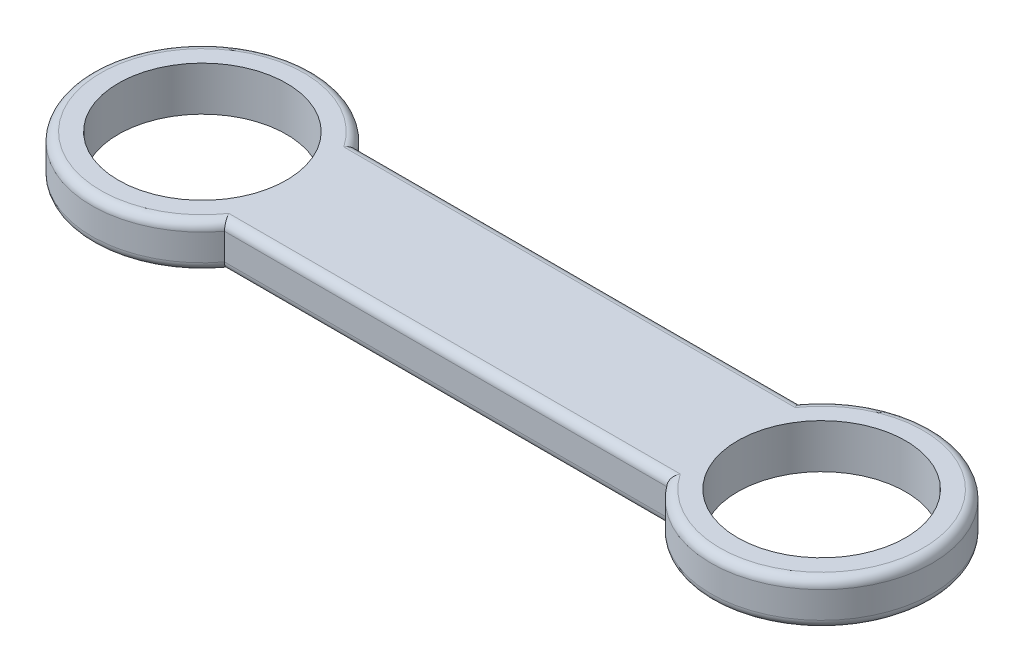
ISO-10303-21;
HEADER;
FILE_DESCRIPTION(('STEP AP214'),'2;1');
FILE_NAME('part.step','',(''),(''),'','','');
FILE_SCHEMA(('AUTOMOTIVE_DESIGN { 1 0 10303 214 1 1 1 1 }'));
ENDSEC;
DATA;
#1=APPLICATION_CONTEXT('core data for automotive mechanical design processes');
#2=APPLICATION_PROTOCOL_DEFINITION('international standard','automotive_design',2000,#1);
#3=PRODUCT_CONTEXT('',#1,'mechanical');
#4=PRODUCT('Part','Part','',(#3));
#5=PRODUCT_RELATED_PRODUCT_CATEGORY('part','',(#4));
#6=PRODUCT_DEFINITION_FORMATION('','',#4);
#7=PRODUCT_DEFINITION_CONTEXT('part definition',#1,'design');
#8=PRODUCT_DEFINITION('design','',#6,#7);
#9=PRODUCT_DEFINITION_SHAPE('','',#8);
#10=(LENGTH_UNIT() NAMED_UNIT(*) SI_UNIT(.MILLI.,.METRE.));
#11=(NAMED_UNIT(*) PLANE_ANGLE_UNIT() SI_UNIT($,.RADIAN.));
#12=(NAMED_UNIT(*) SI_UNIT($,.STERADIAN.) SOLID_ANGLE_UNIT());
#13=UNCERTAINTY_MEASURE_WITH_UNIT(LENGTH_MEASURE(1.E-05),#10,'distance_accuracy_value','');
#14=(GEOMETRIC_REPRESENTATION_CONTEXT(3) GLOBAL_UNCERTAINTY_ASSIGNED_CONTEXT((#13)) GLOBAL_UNIT_ASSIGNED_CONTEXT((#10,
#11,#12)) REPRESENTATION_CONTEXT('',''));
#15=CARTESIAN_POINT('',(0.,0.,0.));
#16=DIRECTION('',(0.,0.,1.));
#17=DIRECTION('',(1.,0.,0.));
#18=AXIS2_PLACEMENT_3D('',#15,#16,#17);
#19=CARTESIAN_POINT('',(0.,5.,0.));
#20=DIRECTION('',(0.,1.,0.));
#21=DIRECTION('',(0.,0.,1.));
#22=AXIS2_PLACEMENT_3D('',#19,#20,#21);
#23=PLANE('',#22);
#24=DIRECTION('',(1.,0.,0.));
#25=VECTOR('',#24,1.);
#26=CARTESIAN_POINT('',(60.,5.,6.5));
#27=LINE('',#26,#25);
#28=CARTESIAN_POINT('',(9.48683298050518,5.,6.5));
#29=VERTEX_POINT('',#28);
#30=CARTESIAN_POINT('',(60.5131670194948,5.,6.5));
#31=VERTEX_POINT('',#30);
#32=EDGE_CURVE('E271',#29,#31,#27,.T.);
#33=ORIENTED_EDGE('',*,*,#32,.T.);
#34=CARTESIAN_POINT('',(70.,5.,0.));
#35=DIRECTION('',(0.,1.,0.));
#36=DIRECTION('',(0.,0.,1.));
#37=AXIS2_PLACEMENT_3D('',#34,#35,#36);
#38=CIRCLE('',#37,11.5);
#39=CARTESIAN_POINT('',(60.5131670194948,5.,-6.5));
#40=VERTEX_POINT('',#39);
#41=EDGE_CURVE('E11',#31,#40,#38,.T.);
#42=ORIENTED_EDGE('',*,*,#41,.T.);
#43=DIRECTION('',(-1.,0.,0.));
#44=VECTOR('',#43,1.);
#45=CARTESIAN_POINT('',(10.,5.,-6.5));
#46=LINE('',#45,#44);
#47=CARTESIAN_POINT('',(9.48683298050518,5.,-6.49999999999993));
#48=VERTEX_POINT('',#47);
#49=EDGE_CURVE('E51',#40,#48,#46,.T.);
#50=ORIENTED_EDGE('',*,*,#49,.T.);
#51=CARTESIAN_POINT('',(0.,5.,0.));
#52=DIRECTION('',(0.,1.,0.));
#53=DIRECTION('',(0.,0.,1.));
#54=AXIS2_PLACEMENT_3D('',#51,#52,#53);
#55=CIRCLE('',#54,11.5);
#56=EDGE_CURVE('E273',#48,#29,#55,.T.);
#57=ORIENTED_EDGE('',*,*,#56,.T.);
#58=EDGE_LOOP('',(#33,#42,#50,#57));
#59=FACE_BOUND('',#58,.T.);
#60=CARTESIAN_POINT('',(0.,5.,0.));
#61=DIRECTION('',(0.,1.,0.));
#62=DIRECTION('',(0.,0.,1.));
#63=AXIS2_PLACEMENT_3D('',#60,#61,#62);
#64=CIRCLE('',#63,9.5);
#65=CARTESIAN_POINT('',(0.,5.,9.5));
#66=VERTEX_POINT('',#65);
#67=EDGE_CURVE('E297',#66,#66,#64,.T.);
#68=ORIENTED_EDGE('',*,*,#67,.F.);
#69=EDGE_LOOP('',(#68));
#70=FACE_BOUND('',#69,.T.);
#71=CARTESIAN_POINT('',(70.,5.,0.));
#72=DIRECTION('',(0.,1.,0.));
#73=DIRECTION('',(0.,0.,1.));
#74=AXIS2_PLACEMENT_3D('',#71,#72,#73);
#75=CIRCLE('',#74,9.49999999999999);
#76=CARTESIAN_POINT('',(70.,5.,9.49999999999999));
#77=VERTEX_POINT('',#76);
#78=EDGE_CURVE('E289',#77,#77,#75,.T.);
#79=ORIENTED_EDGE('',*,*,#78,.F.);
#80=EDGE_LOOP('',(#79));
#81=FACE_BOUND('',#80,.T.);
#82=ADVANCED_FACE('F37',(#59,#70,#81),#23,.T.);
#83=CARTESIAN_POINT('',(0.,0.,0.));
#84=DIRECTION('',(0.,1.,0.));
#85=DIRECTION('',(0.,0.,1.));
#86=AXIS2_PLACEMENT_3D('',#83,#84,#85);
#87=PLANE('',#86);
#88=DIRECTION('',(-1.,0.,0.));
#89=VECTOR('',#88,1.);
#90=CARTESIAN_POINT('',(0.,0.,-6.5));
#91=LINE('',#90,#89);
#92=CARTESIAN_POINT('',(9.48683298050518,0.,-6.49999999999993));
#93=VERTEX_POINT('',#92);
#94=CARTESIAN_POINT('',(60.5131670194948,0.,-6.5));
#95=VERTEX_POINT('',#94);
#96=EDGE_CURVE('E254',#93,#95,#91,.F.);
#97=ORIENTED_EDGE('',*,*,#96,.T.);
#98=CARTESIAN_POINT('',(70.,0.,0.));
#99=DIRECTION('',(0.,1.,0.));
#100=DIRECTION('',(0.,0.,1.));
#101=AXIS2_PLACEMENT_3D('',#98,#99,#100);
#102=CIRCLE('',#101,11.5);
#103=CARTESIAN_POINT('',(60.5131670194948,0.,6.5));
#104=VERTEX_POINT('',#103);
#105=EDGE_CURVE('E120',#95,#104,#102,.F.);
#106=ORIENTED_EDGE('',*,*,#105,.T.);
#107=DIRECTION('',(1.,0.,0.));
#108=VECTOR('',#107,1.);
#109=CARTESIAN_POINT('',(0.,0.,6.5));
#110=LINE('',#109,#108);
#111=CARTESIAN_POINT('',(9.48683298050518,0.,6.5));
#112=VERTEX_POINT('',#111);
#113=EDGE_CURVE('E259',#104,#112,#110,.F.);
#114=ORIENTED_EDGE('',*,*,#113,.T.);
#115=CARTESIAN_POINT('',(0.,0.,0.));
#116=DIRECTION('',(0.,1.,0.));
#117=DIRECTION('',(0.,0.,1.));
#118=AXIS2_PLACEMENT_3D('',#115,#116,#117);
#119=CIRCLE('',#118,11.5);
#120=EDGE_CURVE('E248',#112,#93,#119,.F.);
#121=ORIENTED_EDGE('',*,*,#120,.T.);
#122=EDGE_LOOP('',(#97,#106,#114,#121));
#123=FACE_BOUND('',#122,.T.);
#124=CARTESIAN_POINT('',(0.,0.,0.));
#125=DIRECTION('',(0.,1.,0.));
#126=DIRECTION('',(0.,0.,1.));
#127=AXIS2_PLACEMENT_3D('',#124,#125,#126);
#128=CIRCLE('',#127,9.5);
#129=CARTESIAN_POINT('',(0.,0.,9.5));
#130=VERTEX_POINT('',#129);
#131=EDGE_CURVE('E294',#130,#130,#128,.T.);
#132=ORIENTED_EDGE('',*,*,#131,.T.);
#133=EDGE_LOOP('',(#132));
#134=FACE_BOUND('',#133,.T.);
#135=CARTESIAN_POINT('',(70.,0.,0.));
#136=DIRECTION('',(0.,1.,0.));
#137=DIRECTION('',(0.,0.,1.));
#138=AXIS2_PLACEMENT_3D('',#135,#136,#137);
#139=CIRCLE('',#138,9.49999999999999);
#140=CARTESIAN_POINT('',(70.,0.,9.49999999999999));
#141=VERTEX_POINT('',#140);
#142=EDGE_CURVE('E287',#141,#141,#139,.T.);
#143=ORIENTED_EDGE('',*,*,#142,.T.);
#144=EDGE_LOOP('',(#143));
#145=FACE_BOUND('',#144,.T.);
#146=ADVANCED_FACE('F179',(#123,#134,#145),#87,.F.);
#147=CARTESIAN_POINT('',(0.,5.,0.));
#148=DIRECTION('',(0.,-1.,0.));
#149=DIRECTION('',(0.,0.,-1.));
#150=AXIS2_PLACEMENT_3D('',#147,#148,#149);
#151=CYLINDRICAL_SURFACE('',#150,12.5);
#152=DIRECTION('',(0.,-1.,0.));
#153=VECTOR('',#152,1.);
#154=CARTESIAN_POINT('',(10.,5.,-7.5));
#155=LINE('',#154,#153);
#156=CARTESIAN_POINT('',(10.,4.,-7.5));
#157=VERTEX_POINT('',#156);
#158=CARTESIAN_POINT('',(10.,1.,-7.5));
#159=VERTEX_POINT('',#158);
#160=EDGE_CURVE('E115',#157,#159,#155,.T.);
#161=ORIENTED_EDGE('',*,*,#160,.T.);
#162=CARTESIAN_POINT('',(0.,1.,0.));
#163=DIRECTION('',(0.,1.,0.));
#164=DIRECTION('',(0.,0.,1.));
#165=AXIS2_PLACEMENT_3D('',#162,#163,#164);
#166=CIRCLE('',#165,12.5);
#167=CARTESIAN_POINT('',(10.,1.,7.5));
#168=VERTEX_POINT('',#167);
#169=EDGE_CURVE('E250',#159,#168,#166,.T.);
#170=ORIENTED_EDGE('',*,*,#169,.T.);
#171=DIRECTION('',(0.,-1.,0.));
#172=VECTOR('',#171,1.);
#173=CARTESIAN_POINT('',(10.,5.,7.5));
#174=LINE('',#173,#172);
#175=CARTESIAN_POINT('',(10.,4.,7.5));
#176=VERTEX_POINT('',#175);
#177=EDGE_CURVE('E137',#176,#168,#174,.T.);
#178=ORIENTED_EDGE('',*,*,#177,.F.);
#179=CARTESIAN_POINT('',(0.,4.,0.));
#180=DIRECTION('',(0.,1.,0.));
#181=DIRECTION('',(0.,0.,1.));
#182=AXIS2_PLACEMENT_3D('',#179,#180,#181);
#183=CIRCLE('',#182,12.5);
#184=EDGE_CURVE('E264',#176,#157,#183,.F.);
#185=ORIENTED_EDGE('',*,*,#184,.T.);
#186=EDGE_LOOP('',(#161,#170,#178,#185));
#187=FACE_BOUND('',#186,.T.);
#188=ADVANCED_FACE('F184',(#187),#151,.T.);
#189=CARTESIAN_POINT('',(10.,5.,7.5));
#190=DIRECTION('',(0.,0.,-1.));
#191=DIRECTION('',(-1.,0.,0.));
#192=AXIS2_PLACEMENT_3D('',#189,#190,#191);
#193=PLANE('',#192);
#194=ORIENTED_EDGE('',*,*,#177,.T.);
#195=DIRECTION('',(1.,0.,0.));
#196=VECTOR('',#195,1.);
#197=CARTESIAN_POINT('',(10.,1.,7.5));
#198=LINE('',#197,#196);
#199=CARTESIAN_POINT('',(60.,1.,7.5));
#200=VERTEX_POINT('',#199);
#201=EDGE_CURVE('E269',#168,#200,#198,.T.);
#202=ORIENTED_EDGE('',*,*,#201,.T.);
#203=DIRECTION('',(0.,-1.,0.));
#204=VECTOR('',#203,1.);
#205=CARTESIAN_POINT('',(60.,5.,7.5));
#206=LINE('',#205,#204);
#207=CARTESIAN_POINT('',(60.,4.,7.5));
#208=VERTEX_POINT('',#207);
#209=EDGE_CURVE('E131',#208,#200,#206,.T.);
#210=ORIENTED_EDGE('',*,*,#209,.F.);
#211=DIRECTION('',(1.,0.,0.));
#212=VECTOR('',#211,1.);
#213=CARTESIAN_POINT('',(10.,4.,7.5));
#214=LINE('',#213,#212);
#215=EDGE_CURVE('E267',#208,#176,#214,.F.);
#216=ORIENTED_EDGE('',*,*,#215,.T.);
#217=EDGE_LOOP('',(#194,#202,#210,#216));
#218=FACE_BOUND('',#217,.T.);
#219=ADVANCED_FACE('F196',(#218),#193,.F.);
#220=CARTESIAN_POINT('',(70.,5.,0.));
#221=DIRECTION('',(0.,-1.,0.));
#222=DIRECTION('',(0.,0.,-1.));
#223=AXIS2_PLACEMENT_3D('',#220,#221,#222);
#224=CYLINDRICAL_SURFACE('',#223,12.5);
#225=ORIENTED_EDGE('',*,*,#209,.T.);
#226=CARTESIAN_POINT('',(70.,1.,0.));
#227=DIRECTION('',(0.,1.,0.));
#228=DIRECTION('',(0.,0.,1.));
#229=AXIS2_PLACEMENT_3D('',#226,#227,#228);
#230=CIRCLE('',#229,12.5);
#231=CARTESIAN_POINT('',(60.,1.,-7.5));
#232=VERTEX_POINT('',#231);
#233=EDGE_CURVE('E130',#200,#232,#230,.T.);
#234=ORIENTED_EDGE('',*,*,#233,.T.);
#235=DIRECTION('',(0.,-1.,0.));
#236=VECTOR('',#235,1.);
#237=CARTESIAN_POINT('',(60.,5.,-7.5));
#238=LINE('',#237,#236);
#239=CARTESIAN_POINT('',(60.,4.,-7.5));
#240=VERTEX_POINT('',#239);
#241=EDGE_CURVE('E113',#240,#232,#238,.T.);
#242=ORIENTED_EDGE('',*,*,#241,.F.);
#243=CARTESIAN_POINT('',(70.,4.,0.));
#244=DIRECTION('',(0.,1.,0.));
#245=DIRECTION('',(0.,0.,1.));
#246=AXIS2_PLACEMENT_3D('',#243,#244,#245);
#247=CIRCLE('',#246,12.5);
#248=EDGE_CURVE('E127',#240,#208,#247,.F.);
#249=ORIENTED_EDGE('',*,*,#248,.T.);
#250=EDGE_LOOP('',(#225,#234,#242,#249));
#251=FACE_BOUND('',#250,.T.);
#252=ADVANCED_FACE('F126',(#251),#224,.T.);
#253=CARTESIAN_POINT('',(10.,5.,-7.5));
#254=DIRECTION('',(0.,0.,1.));
#255=DIRECTION('',(1.,0.,0.));
#256=AXIS2_PLACEMENT_3D('',#253,#254,#255);
#257=PLANE('',#256);
#258=ORIENTED_EDGE('',*,*,#241,.T.);
#259=DIRECTION('',(-1.,0.,0.));
#260=VECTOR('',#259,1.);
#261=CARTESIAN_POINT('',(10.,1.,-7.5));
#262=LINE('',#261,#260);
#263=EDGE_CURVE('E119',#232,#159,#262,.T.);
#264=ORIENTED_EDGE('',*,*,#263,.T.);
#265=ORIENTED_EDGE('',*,*,#160,.F.);
#266=DIRECTION('',(-1.,0.,0.));
#267=VECTOR('',#266,1.);
#268=CARTESIAN_POINT('',(60.,4.,-7.5));
#269=LINE('',#268,#267);
#270=EDGE_CURVE('E110',#157,#240,#269,.F.);
#271=ORIENTED_EDGE('',*,*,#270,.T.);
#272=EDGE_LOOP('',(#258,#264,#265,#271));
#273=FACE_BOUND('',#272,.T.);
#274=ADVANCED_FACE('F112',(#273),#257,.F.);
#275=CARTESIAN_POINT('',(0.,5.,0.));
#276=DIRECTION('',(0.,-1.,0.));
#277=DIRECTION('',(0.,0.,-1.));
#278=AXIS2_PLACEMENT_3D('',#275,#276,#277);
#279=CYLINDRICAL_SURFACE('',#278,9.5);
#280=ORIENTED_EDGE('',*,*,#67,.T.);
#281=EDGE_LOOP('',(#280));
#282=FACE_BOUND('',#281,.T.);
#283=ORIENTED_EDGE('',*,*,#131,.F.);
#284=EDGE_LOOP('',(#283));
#285=FACE_BOUND('',#284,.T.);
#286=ADVANCED_FACE('F189',(#282,#285),#279,.F.);
#287=CARTESIAN_POINT('',(70.,5.,0.));
#288=DIRECTION('',(0.,-1.,0.));
#289=DIRECTION('',(0.,0.,-1.));
#290=AXIS2_PLACEMENT_3D('',#287,#288,#289);
#291=CYLINDRICAL_SURFACE('',#290,9.49999999999999);
#292=ORIENTED_EDGE('',*,*,#78,.T.);
#293=EDGE_LOOP('',(#292));
#294=FACE_BOUND('',#293,.T.);
#295=ORIENTED_EDGE('',*,*,#142,.F.);
#296=EDGE_LOOP('',(#295));
#297=FACE_BOUND('',#296,.T.);
#298=ADVANCED_FACE('F235',(#294,#297),#291,.F.);
#299=CARTESIAN_POINT('',(0.,1.,0.));
#300=DIRECTION('',(0.,1.,0.));
#301=DIRECTION('',(0.,0.,1.));
#302=AXIS2_PLACEMENT_3D('',#299,#300,#301);
#303=TOROIDAL_SURFACE('',#302,11.5,1.);
#304=CARTESIAN_POINT('',(10.,1.,-7.5));
#305=CARTESIAN_POINT('',(10.0000004758087,0.974022793311546,-7.500001202886));
#306=CARTESIAN_POINT('',(9.99949352827707,0.948058855470432,-7.49898703068729));
#307=CARTESIAN_POINT('',(9.99747493147311,0.896333533341106,-7.49495034829581));
#308=CARTESIAN_POINT('',(9.99596354221496,0.870572098377917,-7.49192835785571));
#309=CARTESIAN_POINT('',(9.98995487397723,0.794056155931436,-7.47991814361837));
#310=CARTESIAN_POINT('',(9.98398288866724,0.743842783014862,-7.46798523082094));
#311=CARTESIAN_POINT('',(9.96835522827276,0.646423053679939,-7.43680458576413));
#312=CARTESIAN_POINT('',(9.95870150303451,0.599215120999351,-7.41756072539695));
#313=CARTESIAN_POINT('',(9.93607459389465,0.508864905381531,-7.37254507090801));
#314=CARTESIAN_POINT('',(9.92309948357589,0.465725001855554,-7.34676948844785));
#315=CARTESIAN_POINT('',(9.89368047892262,0.382754449695858,-7.28846890109732));
#316=CARTESIAN_POINT('',(9.87711681533836,0.343130182966889,-7.25571173192295));
#317=CARTESIAN_POINT('',(9.84138609262994,0.26992653542802,-7.1852561146381));
#318=CARTESIAN_POINT('',(9.82221830455551,0.236348853328713,-7.14755628307423));
#319=CARTESIAN_POINT('',(9.77976166471258,0.172623211243956,-7.06432445679231));
#320=CARTESIAN_POINT('',(9.75625239975256,0.143153462494501,-7.01838625967242));
#321=CARTESIAN_POINT('',(9.70731652672982,0.0923269903444444,-6.92313950811566));
#322=CARTESIAN_POINT('',(9.68188843175124,0.0709766377249933,-6.87382834276639));
#323=CARTESIAN_POINT('',(9.62914011418951,0.0361537771219373,-6.77196281506131));
#324=CARTESIAN_POINT('',(9.60179035574918,0.0228674058039202,-6.71936066989013));
#325=CARTESIAN_POINT('',(9.54634265158448,0.00497372626209113,-6.613189213109));
#326=CARTESIAN_POINT('',(9.51824635996518,0.000348627834511646,-6.55962211265339));
#327=CARTESIAN_POINT('',(9.48899724180388,6.31232286596967E-06,-6.50410674552687));
#328=CARTESIAN_POINT('',(9.48791515406522,-1.24397043238607E-08,-6.50205327685659));
#329=CARTESIAN_POINT('',(9.48683298050514,0.,-6.5));
#330=B_SPLINE_CURVE_WITH_KNOTS('',3,(#304,#305,#306,#307,#308,#309,#310,#311,#312,#313,#314,
#315,#316,#317,#318,#319,#320,#321,#322,#323,#324,#325,#326,#327,#328,#329),.UNSPECIFIED.,.F.,
.F.,(4,2,2,2,2,2,2,2,2,2,2,2,4),(0.,0.0778809431952193,0.155741733637133,0.310790795766131,
0.465757857817843,0.620815005872289,0.782188307542208,0.943606874488299,1.12115873988898,
1.29884963307286,1.48049988198648,1.66177661137021,1.66873998826391),.UNSPECIFIED.);
#331=EDGE_CURVE('E222',#93,#159,#330,.F.);
#332=ORIENTED_EDGE('',*,*,#331,.F.);
#333=ORIENTED_EDGE('',*,*,#120,.F.);
#334=CARTESIAN_POINT('',(10.,1.,7.5));
#335=CARTESIAN_POINT('',(10.0000004758087,0.974022793311546,7.500001202886));
#336=CARTESIAN_POINT('',(9.99949352827707,0.948058855470432,7.49898703068729));
#337=CARTESIAN_POINT('',(9.99747493147311,0.896333533341106,7.49495034829581));
#338=CARTESIAN_POINT('',(9.99596354221496,0.870572098377917,7.49192835785571));
#339=CARTESIAN_POINT('',(9.98995487397723,0.794056155931436,7.47991814361837));
#340=CARTESIAN_POINT('',(9.98398288866724,0.743842783014862,7.46798523082094));
#341=CARTESIAN_POINT('',(9.96835522827276,0.646423053679939,7.43680458576413));
#342=CARTESIAN_POINT('',(9.95870150303451,0.599215120999351,7.41756072539695));
#343=CARTESIAN_POINT('',(9.93607459389465,0.508864905381531,7.37254507090801));
#344=CARTESIAN_POINT('',(9.92309948357589,0.465725001855554,7.34676948844785));
#345=CARTESIAN_POINT('',(9.89368047892262,0.382754449695858,7.28846890109732));
#346=CARTESIAN_POINT('',(9.87711681533836,0.343130182966889,7.25571173192295));
#347=CARTESIAN_POINT('',(9.84138609262994,0.26992653542802,7.1852561146381));
#348=CARTESIAN_POINT('',(9.82221830455551,0.236348853328713,7.14755628307423));
#349=CARTESIAN_POINT('',(9.77976166471258,0.172623211243956,7.06432445679231));
#350=CARTESIAN_POINT('',(9.75625239975256,0.143153462494501,7.01838625967242));
#351=CARTESIAN_POINT('',(9.70731652672982,0.0923269903444444,6.92313950811566));
#352=CARTESIAN_POINT('',(9.68188843175124,0.0709766377249933,6.87382834276639));
#353=CARTESIAN_POINT('',(9.62914011418951,0.0361537771219373,6.77196281506131));
#354=CARTESIAN_POINT('',(9.60179035574918,0.0228674058039202,6.71936066989013));
#355=CARTESIAN_POINT('',(9.54634265158448,0.00497372626209113,6.613189213109));
#356=CARTESIAN_POINT('',(9.51824635996518,0.000348627834511646,6.55962211265339));
#357=CARTESIAN_POINT('',(9.48899724180388,6.31232286596966E-06,6.50410674552687));
#358=CARTESIAN_POINT('',(9.48791515406522,-1.24397043238662E-08,6.50205327685659));
#359=CARTESIAN_POINT('',(9.48683298050514,0.,6.5));
#360=B_SPLINE_CURVE_WITH_KNOTS('',3,(#334,#335,#336,#337,#338,#339,#340,#341,#342,#343,#344,
#345,#346,#347,#348,#349,#350,#351,#352,#353,#354,#355,#356,#357,#358,#359),.UNSPECIFIED.,.F.,
.F.,(4,2,2,2,2,2,2,2,2,2,2,2,4),(0.,0.0778809431952193,0.155741733637133,0.310790795766131,
0.465757857817843,0.620815005872289,0.782188307542208,0.943606874488299,1.12115873988898,
1.29884963307286,1.48049988198648,1.66177661137021,1.66873998826391),.UNSPECIFIED.);
#361=EDGE_CURVE('E150',#168,#112,#360,.T.);
#362=ORIENTED_EDGE('',*,*,#361,.F.);
#363=ORIENTED_EDGE('',*,*,#169,.F.);
#364=EDGE_LOOP('',(#332,#333,#362,#363));
#365=FACE_BOUND('',#364,.T.);
#366=ADVANCED_FACE('F230',(#365),#303,.T.);
#367=CARTESIAN_POINT('',(10.,1.,6.5));
#368=DIRECTION('',(1.,0.,0.));
#369=DIRECTION('',(0.,0.,-1.));
#370=AXIS2_PLACEMENT_3D('',#367,#368,#369);
#371=CYLINDRICAL_SURFACE('',#370,1.);
#372=ORIENTED_EDGE('',*,*,#361,.T.);
#373=ORIENTED_EDGE('',*,*,#113,.F.);
#374=CARTESIAN_POINT('',(60.,1.,7.5));
#375=CARTESIAN_POINT('',(59.9999995241913,0.974022793311546,7.500001202886));
#376=CARTESIAN_POINT('',(60.0005064717229,0.948058855470432,7.49898703068729));
#377=CARTESIAN_POINT('',(60.0025250685269,0.896333533341106,7.49495034829581));
#378=CARTESIAN_POINT('',(60.004036457785,0.870572098377917,7.49192835785571));
#379=CARTESIAN_POINT('',(60.0100451260228,0.794056155931436,7.47991814361837));
#380=CARTESIAN_POINT('',(60.0160171113328,0.743842783014862,7.46798523082094));
#381=CARTESIAN_POINT('',(60.0316447717273,0.646423053679939,7.43680458576413));
#382=CARTESIAN_POINT('',(60.0412984969655,0.599215120999351,7.41756072539694));
#383=CARTESIAN_POINT('',(60.0639254061053,0.508864905381532,7.37254507090801));
#384=CARTESIAN_POINT('',(60.0769005164241,0.465725001855554,7.34676948844785));
#385=CARTESIAN_POINT('',(60.1063195210774,0.382754449695858,7.28846890109731));
#386=CARTESIAN_POINT('',(60.1228831846616,0.34313018296689,7.25571173192295));
#387=CARTESIAN_POINT('',(60.1586139073701,0.269926535428021,7.1852561146381));
#388=CARTESIAN_POINT('',(60.1777816954445,0.236348853328713,7.14755628307423));
#389=CARTESIAN_POINT('',(60.2202383352874,0.172623211243956,7.06432445679231));
#390=CARTESIAN_POINT('',(60.2437476002475,0.143153462494501,7.01838625967242));
#391=CARTESIAN_POINT('',(60.2926834732702,0.0923269903444444,6.92313950811565));
#392=CARTESIAN_POINT('',(60.3181115682488,0.070976637724993,6.87382834276639));
#393=CARTESIAN_POINT('',(60.3708598858105,0.0361537771219368,6.77196281506131));
#394=CARTESIAN_POINT('',(60.3982096442508,0.0228674058039199,6.71936066989013));
#395=CARTESIAN_POINT('',(60.4536573484155,0.00497372626209091,6.61318921310899));
#396=CARTESIAN_POINT('',(60.4817536400348,0.000348627834511574,6.55962211265337));
#397=CARTESIAN_POINT('',(60.5110027581961,6.3123228659665E-06,6.50410674552687));
#398=CARTESIAN_POINT('',(60.5120848459348,-1.24397043246441E-08,6.50205327685659));
#399=CARTESIAN_POINT('',(60.5131670194949,0.,6.5));
#400=B_SPLINE_CURVE_WITH_KNOTS('',3,(#374,#375,#376,#377,#378,#379,#380,#381,#382,#383,#384,
#385,#386,#387,#388,#389,#390,#391,#392,#393,#394,#395,#396,#397,#398,#399),.UNSPECIFIED.,.F.,
.F.,(4,2,2,2,2,2,2,2,2,2,2,2,4),(0.,0.0778809431952194,0.155741733637133,0.310790795766131,
0.465757857817842,0.620815005872288,0.782188307542209,0.943606874488298,1.12115873988898,
1.29884963307286,1.48049988198648,1.66177661137022,1.66873998826391),.UNSPECIFIED.);
#401=EDGE_CURVE('E217',#200,#104,#400,.T.);
#402=ORIENTED_EDGE('',*,*,#401,.F.);
#403=ORIENTED_EDGE('',*,*,#201,.F.);
#404=EDGE_LOOP('',(#372,#373,#402,#403));
#405=FACE_BOUND('',#404,.T.);
#406=ADVANCED_FACE('F227',(#405),#371,.T.);
#407=CARTESIAN_POINT('',(10.,1.,-6.5));
#408=DIRECTION('',(-1.,0.,0.));
#409=DIRECTION('',(0.,0.,1.));
#410=AXIS2_PLACEMENT_3D('',#407,#408,#409);
#411=CYLINDRICAL_SURFACE('',#410,1.);
#412=ORIENTED_EDGE('',*,*,#331,.T.);
#413=ORIENTED_EDGE('',*,*,#263,.F.);
#414=CARTESIAN_POINT('',(60.,1.,-7.5));
#415=CARTESIAN_POINT('',(59.9999995241913,0.974022793311546,-7.500001202886));
#416=CARTESIAN_POINT('',(60.0005064717229,0.948058855470432,-7.49898703068729));
#417=CARTESIAN_POINT('',(60.0025250685269,0.896333533341106,-7.49495034829581));
#418=CARTESIAN_POINT('',(60.004036457785,0.870572098377917,-7.49192835785571));
#419=CARTESIAN_POINT('',(60.0100451260228,0.794056155931436,-7.47991814361837));
#420=CARTESIAN_POINT('',(60.0160171113328,0.743842783014862,-7.46798523082094));
#421=CARTESIAN_POINT('',(60.0316447717273,0.646423053679939,-7.43680458576413));
#422=CARTESIAN_POINT('',(60.0412984969655,0.599215120999351,-7.41756072539695));
#423=CARTESIAN_POINT('',(60.0639254061053,0.508864905381531,-7.37254507090801));
#424=CARTESIAN_POINT('',(60.0769005164241,0.465725001855553,-7.34676948844785));
#425=CARTESIAN_POINT('',(60.1063195210774,0.382754449695857,-7.28846890109732));
#426=CARTESIAN_POINT('',(60.1228831846616,0.343130182966889,-7.25571173192295));
#427=CARTESIAN_POINT('',(60.1586139073701,0.26992653542802,-7.1852561146381));
#428=CARTESIAN_POINT('',(60.1777816954445,0.236348853328713,-7.14755628307423));
#429=CARTESIAN_POINT('',(60.2202383352874,0.172623211243956,-7.06432445679231));
#430=CARTESIAN_POINT('',(60.2437476002475,0.1431534624945,-7.01838625967242));
#431=CARTESIAN_POINT('',(60.2926834732702,0.0923269903444442,-6.92313950811565));
#432=CARTESIAN_POINT('',(60.3181115682488,0.0709766377249937,-6.87382834276639));
#433=CARTESIAN_POINT('',(60.3708598858105,0.0361537771219387,-6.77196281506131));
#434=CARTESIAN_POINT('',(60.3982096442508,0.0228674058039219,-6.71936066989014));
#435=CARTESIAN_POINT('',(60.4536573484155,0.00497372626209207,-6.613189213109));
#436=CARTESIAN_POINT('',(60.4817536400348,0.000348627834512351,-6.55962211265338));
#437=CARTESIAN_POINT('',(60.5110027581961,6.31232286601901E-06,-6.50410674552687));
#438=CARTESIAN_POINT('',(60.5120848459348,-1.24397042993203E-08,-6.50205327685659));
#439=CARTESIAN_POINT('',(60.5131670194949,0.,-6.5));
#440=B_SPLINE_CURVE_WITH_KNOTS('',3,(#414,#415,#416,#417,#418,#419,#420,#421,#422,#423,#424,
#425,#426,#427,#428,#429,#430,#431,#432,#433,#434,#435,#436,#437,#438,#439),.UNSPECIFIED.,.F.,
.F.,(4,2,2,2,2,2,2,2,2,2,2,2,4),(0.,0.0778809431952193,0.155741733637134,0.310790795766132,
0.465757857817843,0.620815005872289,0.78218830754221,0.943606874488302,1.12115873988898,
1.29884963307286,1.48049988198647,1.66177661137021,1.66873998826391),.UNSPECIFIED.);
#441=EDGE_CURVE('E211',#95,#232,#440,.F.);
#442=ORIENTED_EDGE('',*,*,#441,.F.);
#443=ORIENTED_EDGE('',*,*,#96,.F.);
#444=EDGE_LOOP('',(#412,#413,#442,#443));
#445=FACE_BOUND('',#444,.T.);
#446=ADVANCED_FACE('F206',(#445),#411,.T.);
#447=CARTESIAN_POINT('',(70.,1.,0.));
#448=DIRECTION('',(0.,1.,0.));
#449=DIRECTION('',(0.,0.,1.));
#450=AXIS2_PLACEMENT_3D('',#447,#448,#449);
#451=TOROIDAL_SURFACE('',#450,11.5,1.);
#452=ORIENTED_EDGE('',*,*,#401,.T.);
#453=ORIENTED_EDGE('',*,*,#105,.F.);
#454=ORIENTED_EDGE('',*,*,#441,.T.);
#455=ORIENTED_EDGE('',*,*,#233,.F.);
#456=EDGE_LOOP('',(#452,#453,#454,#455));
#457=FACE_BOUND('',#456,.T.);
#458=ADVANCED_FACE('F175',(#457),#451,.T.);
#459=CARTESIAN_POINT('',(0.,4.,0.));
#460=DIRECTION('',(0.,1.,0.));
#461=DIRECTION('',(0.,0.,1.));
#462=AXIS2_PLACEMENT_3D('',#459,#460,#461);
#463=TOROIDAL_SURFACE('',#462,11.5,1.);
#464=CARTESIAN_POINT('',(10.,4.,-7.5));
#465=CARTESIAN_POINT('',(10.0000004758087,4.02597720668845,-7.500001202886));
#466=CARTESIAN_POINT('',(9.99949352827707,4.05194114452957,-7.49898703068729));
#467=CARTESIAN_POINT('',(9.99747493147311,4.10366646665889,-7.49495034829581));
#468=CARTESIAN_POINT('',(9.99596354221496,4.12942790162208,-7.49192835785571));
#469=CARTESIAN_POINT('',(9.98995487397723,4.20594384406856,-7.47991814361837));
#470=CARTESIAN_POINT('',(9.98398288866724,4.25615721698514,-7.46798523082094));
#471=CARTESIAN_POINT('',(9.96835522827276,4.35357694632006,-7.43680458576413));
#472=CARTESIAN_POINT('',(9.95870150303451,4.40078487900065,-7.41756072539695));
#473=CARTESIAN_POINT('',(9.93607459389465,4.49113509461847,-7.37254507090801));
#474=CARTESIAN_POINT('',(9.92309948357589,4.53427499814445,-7.34676948844785));
#475=CARTESIAN_POINT('',(9.89368047892262,4.61724555030414,-7.28846890109732));
#476=CARTESIAN_POINT('',(9.87711681533836,4.65686981703311,-7.25571173192295));
#477=CARTESIAN_POINT('',(9.84138609262994,4.73007346457198,-7.1852561146381));
#478=CARTESIAN_POINT('',(9.82221830455551,4.76365114667129,-7.14755628307423));
#479=CARTESIAN_POINT('',(9.77976166471258,4.82737678875604,-7.06432445679231));
#480=CARTESIAN_POINT('',(9.75625239975256,4.8568465375055,-7.01838625967242));
#481=CARTESIAN_POINT('',(9.70731652672982,4.90767300965556,-6.92313950811566));
#482=CARTESIAN_POINT('',(9.68188843175124,4.92902336227501,-6.87382834276639));
#483=CARTESIAN_POINT('',(9.62914011418951,4.96384622287806,-6.77196281506131));
#484=CARTESIAN_POINT('',(9.60179035574918,4.97713259419608,-6.71936066989013));
#485=CARTESIAN_POINT('',(9.54634265158448,4.99502627373791,-6.613189213109));
#486=CARTESIAN_POINT('',(9.51824635996519,4.99965137216549,-6.55962211265339));
#487=CARTESIAN_POINT('',(9.48899724180388,4.99999368767713,-6.50410674552687));
#488=CARTESIAN_POINT('',(9.48791515406522,5.0000000124397,-6.50205327685659));
#489=CARTESIAN_POINT('',(9.48683298050514,5.,-6.5));
#490=B_SPLINE_CURVE_WITH_KNOTS('',3,(#464,#465,#466,#467,#468,#469,#470,#471,#472,#473,#474,
#475,#476,#477,#478,#479,#480,#481,#482,#483,#484,#485,#486,#487,#488,#489),.UNSPECIFIED.,.F.,
.F.,(4,2,2,2,2,2,2,2,2,2,2,2,4),(0.,0.0778809431952186,0.155741733637133,0.310790795766131,
0.465757857817843,0.620815005872288,0.782188307542209,0.9436068744883,1.12115873988898,
1.29884963307286,1.48049988198648,1.66177661137021,1.66873998826391),.UNSPECIFIED.);
#491=EDGE_CURVE('E141',#157,#48,#490,.T.);
#492=ORIENTED_EDGE('',*,*,#491,.F.);
#493=ORIENTED_EDGE('',*,*,#184,.F.);
#494=CARTESIAN_POINT('',(10.,4.,7.5));
#495=CARTESIAN_POINT('',(10.0000004758087,4.02597720668845,7.500001202886));
#496=CARTESIAN_POINT('',(9.99949352827707,4.05194114452957,7.49898703068729));
#497=CARTESIAN_POINT('',(9.99747493147311,4.10366646665889,7.49495034829581));
#498=CARTESIAN_POINT('',(9.99596354221496,4.12942790162208,7.49192835785571));
#499=CARTESIAN_POINT('',(9.98995487397723,4.20594384406856,7.47991814361837));
#500=CARTESIAN_POINT('',(9.98398288866724,4.25615721698514,7.46798523082094));
#501=CARTESIAN_POINT('',(9.96835522827276,4.35357694632006,7.43680458576413));
#502=CARTESIAN_POINT('',(9.95870150303451,4.40078487900065,7.41756072539695));
#503=CARTESIAN_POINT('',(9.93607459389465,4.49113509461847,7.37254507090801));
#504=CARTESIAN_POINT('',(9.92309948357589,4.53427499814445,7.34676948844785));
#505=CARTESIAN_POINT('',(9.89368047892262,4.61724555030414,7.28846890109732));
#506=CARTESIAN_POINT('',(9.87711681533836,4.65686981703311,7.25571173192295));
#507=CARTESIAN_POINT('',(9.84138609262994,4.73007346457198,7.1852561146381));
#508=CARTESIAN_POINT('',(9.82221830455551,4.76365114667129,7.14755628307423));
#509=CARTESIAN_POINT('',(9.77976166471258,4.82737678875604,7.06432445679231));
#510=CARTESIAN_POINT('',(9.75625239975256,4.8568465375055,7.01838625967242));
#511=CARTESIAN_POINT('',(9.70731652672982,4.90767300965556,6.92313950811565));
#512=CARTESIAN_POINT('',(9.68188843175125,4.92902336227501,6.87382834276639));
#513=CARTESIAN_POINT('',(9.6291401141895,4.96384622287806,6.77196281506131));
#514=CARTESIAN_POINT('',(9.60179035574916,4.97713259419608,6.71936066989014));
#515=CARTESIAN_POINT('',(9.54634265158449,4.99502627373791,6.61318921310899));
#516=CARTESIAN_POINT('',(9.51824635996525,4.99965137216549,6.55962211265336));
#517=CARTESIAN_POINT('',(9.48899724180388,4.99999368767713,6.50410674552687));
#518=CARTESIAN_POINT('',(9.48791515406523,5.0000000124397,6.50205327685659));
#519=CARTESIAN_POINT('',(9.48683298050514,5.,6.5));
#520=B_SPLINE_CURVE_WITH_KNOTS('',3,(#494,#495,#496,#497,#498,#499,#500,#501,#502,#503,#504,
#505,#506,#507,#508,#509,#510,#511,#512,#513,#514,#515,#516,#517,#518,#519),.UNSPECIFIED.,.F.,
.F.,(4,2,2,2,2,2,2,2,2,2,2,2,4),(0.,0.0778809431952186,0.155741733637132,0.310790795766131,
0.465757857817843,0.620815005872288,0.782188307542208,0.943606874488299,1.12115873988898,
1.29884963307286,1.48049988198648,1.66177661137021,1.66873998826391),.UNSPECIFIED.);
#521=EDGE_CURVE('E42',#29,#176,#520,.F.);
#522=ORIENTED_EDGE('',*,*,#521,.F.);
#523=ORIENTED_EDGE('',*,*,#56,.F.);
#524=EDGE_LOOP('',(#492,#493,#522,#523));
#525=FACE_BOUND('',#524,.T.);
#526=ADVANCED_FACE('F39',(#525),#463,.T.);
#527=CARTESIAN_POINT('',(0.,4.,6.5));
#528=DIRECTION('',(-1.,0.,0.));
#529=DIRECTION('',(0.,0.,1.));
#530=AXIS2_PLACEMENT_3D('',#527,#528,#529);
#531=CYLINDRICAL_SURFACE('',#530,1.);
#532=ORIENTED_EDGE('',*,*,#521,.T.);
#533=ORIENTED_EDGE('',*,*,#215,.F.);
#534=CARTESIAN_POINT('',(60.,4.,7.5));
#535=CARTESIAN_POINT('',(59.9999995241913,4.02597720668845,7.500001202886));
#536=CARTESIAN_POINT('',(60.0005064717229,4.05194114452957,7.49898703068729));
#537=CARTESIAN_POINT('',(60.0025250685269,4.10366646665889,7.49495034829581));
#538=CARTESIAN_POINT('',(60.004036457785,4.12942790162208,7.49192835785571));
#539=CARTESIAN_POINT('',(60.0100451260228,4.20594384406856,7.47991814361836));
#540=CARTESIAN_POINT('',(60.0160171113328,4.25615721698514,7.46798523082094));
#541=CARTESIAN_POINT('',(60.0316447717273,4.35357694632006,7.43680458576413));
#542=CARTESIAN_POINT('',(60.0412984969655,4.40078487900065,7.41756072539694));
#543=CARTESIAN_POINT('',(60.0639254061053,4.49113509461847,7.37254507090801));
#544=CARTESIAN_POINT('',(60.0769005164241,4.53427499814445,7.34676948844785));
#545=CARTESIAN_POINT('',(60.1063195210774,4.61724555030414,7.28846890109731));
#546=CARTESIAN_POINT('',(60.1228831846616,4.65686981703311,7.25571173192295));
#547=CARTESIAN_POINT('',(60.1586139073701,4.73007346457198,7.1852561146381));
#548=CARTESIAN_POINT('',(60.1777816954445,4.76365114667129,7.14755628307423));
#549=CARTESIAN_POINT('',(60.2202383352874,4.82737678875604,7.06432445679231));
#550=CARTESIAN_POINT('',(60.2437476002474,4.8568465375055,7.01838625967242));
#551=CARTESIAN_POINT('',(60.2926834732702,4.90767300965556,6.92313950811565));
#552=CARTESIAN_POINT('',(60.3181115682488,4.92902336227501,6.8738283427664));
#553=CARTESIAN_POINT('',(60.3708598858105,4.96384622287806,6.7719628150613));
#554=CARTESIAN_POINT('',(60.3982096442508,4.97713259419608,6.71936066989011));
#555=CARTESIAN_POINT('',(60.4536573484156,4.99502627373791,6.61318921310902));
#556=CARTESIAN_POINT('',(60.481753640035,4.99965137216549,6.55962211265347));
#557=CARTESIAN_POINT('',(60.5110027581961,4.99999368767713,6.50410674552687));
#558=CARTESIAN_POINT('',(60.5120848459348,5.0000000124397,6.50205327685659));
#559=CARTESIAN_POINT('',(60.5131670194949,5.,6.5));
#560=B_SPLINE_CURVE_WITH_KNOTS('',3,(#534,#535,#536,#537,#538,#539,#540,#541,#542,#543,#544,
#545,#546,#547,#548,#549,#550,#551,#552,#553,#554,#555,#556,#557,#558,#559),.UNSPECIFIED.,.F.,
.F.,(4,2,2,2,2,2,2,2,2,2,2,2,4),(0.,0.0778809431952186,0.155741733637132,0.310790795766131,
0.465757857817843,0.620815005872288,0.782188307542207,0.943606874488299,1.12115873988899,
1.29884963307286,1.48049988198648,1.66177661137022,1.66873998826391),.UNSPECIFIED.);
#561=EDGE_CURVE('E135',#31,#208,#560,.F.);
#562=ORIENTED_EDGE('',*,*,#561,.F.);
#563=ORIENTED_EDGE('',*,*,#32,.F.);
#564=EDGE_LOOP('',(#532,#533,#562,#563));
#565=FACE_BOUND('',#564,.T.);
#566=ADVANCED_FACE('F165',(#565),#531,.T.);
#567=CARTESIAN_POINT('',(0.,4.,-6.5));
#568=DIRECTION('',(1.,0.,0.));
#569=DIRECTION('',(0.,0.,-1.));
#570=AXIS2_PLACEMENT_3D('',#567,#568,#569);
#571=CYLINDRICAL_SURFACE('',#570,1.);
#572=ORIENTED_EDGE('',*,*,#491,.T.);
#573=ORIENTED_EDGE('',*,*,#49,.F.);
#574=CARTESIAN_POINT('',(60.,4.,-7.5));
#575=CARTESIAN_POINT('',(59.9999995241913,4.02597720668845,-7.500001202886));
#576=CARTESIAN_POINT('',(60.0005064717229,4.05194114452957,-7.49898703068729));
#577=CARTESIAN_POINT('',(60.0025250685269,4.10366646665889,-7.49495034829581));
#578=CARTESIAN_POINT('',(60.004036457785,4.12942790162208,-7.49192835785571));
#579=CARTESIAN_POINT('',(60.0100451260228,4.20594384406856,-7.47991814361837));
#580=CARTESIAN_POINT('',(60.0160171113328,4.25615721698514,-7.46798523082094));
#581=CARTESIAN_POINT('',(60.0316447717273,4.35357694632006,-7.43680458576413));
#582=CARTESIAN_POINT('',(60.0412984969655,4.40078487900065,-7.41756072539695));
#583=CARTESIAN_POINT('',(60.0639254061053,4.49113509461847,-7.37254507090801));
#584=CARTESIAN_POINT('',(60.0769005164241,4.53427499814445,-7.34676948844785));
#585=CARTESIAN_POINT('',(60.1063195210774,4.61724555030414,-7.28846890109732));
#586=CARTESIAN_POINT('',(60.1228831846616,4.65686981703311,-7.25571173192295));
#587=CARTESIAN_POINT('',(60.1586139073701,4.73007346457198,-7.1852561146381));
#588=CARTESIAN_POINT('',(60.1777816954445,4.76365114667129,-7.14755628307423));
#589=CARTESIAN_POINT('',(60.2202383352874,4.82737678875604,-7.06432445679231));
#590=CARTESIAN_POINT('',(60.2437476002475,4.8568465375055,-7.01838625967243));
#591=CARTESIAN_POINT('',(60.2926834732702,4.90767300965556,-6.92313950811566));
#592=CARTESIAN_POINT('',(60.3181115682488,4.92902336227501,-6.87382834276639));
#593=CARTESIAN_POINT('',(60.3708598858105,4.96384622287806,-6.77196281506131));
#594=CARTESIAN_POINT('',(60.3982096442508,4.97713259419608,-6.71936066989014));
#595=CARTESIAN_POINT('',(60.4536573484155,4.99502627373791,-6.613189213109));
#596=CARTESIAN_POINT('',(60.4817536400348,4.99965137216549,-6.55962211265338));
#597=CARTESIAN_POINT('',(60.5110027581961,4.99999368767713,-6.50410674552687));
#598=CARTESIAN_POINT('',(60.5120848459348,5.0000000124397,-6.50205327685659));
#599=CARTESIAN_POINT('',(60.5131670194949,5.,-6.5));
#600=B_SPLINE_CURVE_WITH_KNOTS('',3,(#574,#575,#576,#577,#578,#579,#580,#581,#582,#583,#584,
#585,#586,#587,#588,#589,#590,#591,#592,#593,#594,#595,#596,#597,#598,#599),.UNSPECIFIED.,.F.,
.F.,(4,2,2,2,2,2,2,2,2,2,2,2,4),(0.,0.0778809431952178,0.155741733637132,0.310790795766131,
0.465757857817842,0.620815005872289,0.78218830754221,0.943606874488302,1.12115873988898,
1.29884963307286,1.48049988198647,1.66177661137021,1.66873998826391),.UNSPECIFIED.);
#601=EDGE_CURVE('E59',#240,#40,#600,.T.);
#602=ORIENTED_EDGE('',*,*,#601,.F.);
#603=ORIENTED_EDGE('',*,*,#270,.F.);
#604=EDGE_LOOP('',(#572,#573,#602,#603));
#605=FACE_BOUND('',#604,.T.);
#606=ADVANCED_FACE('F139',(#605),#571,.T.);
#607=CARTESIAN_POINT('',(70.,4.,0.));
#608=DIRECTION('',(0.,1.,0.));
#609=DIRECTION('',(0.,0.,1.));
#610=AXIS2_PLACEMENT_3D('',#607,#608,#609);
#611=TOROIDAL_SURFACE('',#610,11.5,1.);
#612=ORIENTED_EDGE('',*,*,#561,.T.);
#613=ORIENTED_EDGE('',*,*,#248,.F.);
#614=ORIENTED_EDGE('',*,*,#601,.T.);
#615=ORIENTED_EDGE('',*,*,#41,.F.);
#616=EDGE_LOOP('',(#612,#613,#614,#615));
#617=FACE_BOUND('',#616,.T.);
#618=ADVANCED_FACE('F133',(#617),#611,.T.);
#619=CLOSED_SHELL('',(#82,#146,#188,#219,#252,#274,#286,#298,#366,#406,#446,#458,#526,#566,#606,#618));
#620=MANIFOLD_SOLID_BREP('B2',#619);
#621=ADVANCED_BREP_SHAPE_REPRESENTATION('',(#18,#620),#14);
#622=SHAPE_DEFINITION_REPRESENTATION(#9,#621);
ENDSEC;
END-ISO-10303-21;
